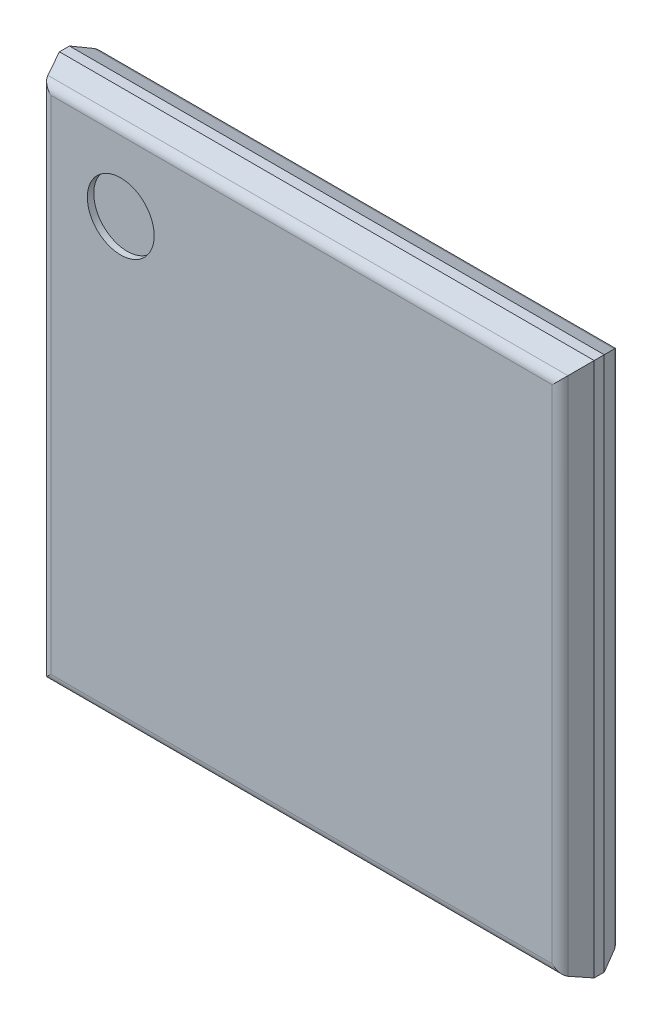
ISO-10303-21;
HEADER;
FILE_DESCRIPTION(('STEP AP214'),'2;1');
FILE_NAME('part.step','',(''),(''),'','','');
FILE_SCHEMA(('AUTOMOTIVE_DESIGN { 1 0 10303 214 1 1 1 1 }'));
ENDSEC;
DATA;
#1=APPLICATION_CONTEXT('core data for automotive mechanical design processes');
#2=APPLICATION_PROTOCOL_DEFINITION('international standard','automotive_design',2000,#1);
#3=PRODUCT_CONTEXT('',#1,'mechanical');
#4=PRODUCT('Part','Part','',(#3));
#5=PRODUCT_RELATED_PRODUCT_CATEGORY('part','',(#4));
#6=PRODUCT_DEFINITION_FORMATION('','',#4);
#7=PRODUCT_DEFINITION_CONTEXT('part definition',#1,'design');
#8=PRODUCT_DEFINITION('design','',#6,#7);
#9=PRODUCT_DEFINITION_SHAPE('','',#8);
#10=(LENGTH_UNIT() NAMED_UNIT(*) SI_UNIT(.MILLI.,.METRE.));
#11=(NAMED_UNIT(*) PLANE_ANGLE_UNIT() SI_UNIT($,.RADIAN.));
#12=(NAMED_UNIT(*) SI_UNIT($,.STERADIAN.) SOLID_ANGLE_UNIT());
#13=UNCERTAINTY_MEASURE_WITH_UNIT(LENGTH_MEASURE(1.E-05),#10,'distance_accuracy_value','');
#14=(GEOMETRIC_REPRESENTATION_CONTEXT(3) GLOBAL_UNCERTAINTY_ASSIGNED_CONTEXT((#13)) GLOBAL_UNIT_ASSIGNED_CONTEXT((#10,
#11,#12)) REPRESENTATION_CONTEXT('',''));
#15=CARTESIAN_POINT('',(0.,0.,0.));
#16=DIRECTION('',(0.,0.,1.));
#17=DIRECTION('',(1.,0.,0.));
#18=AXIS2_PLACEMENT_3D('',#15,#16,#17);
#19=CARTESIAN_POINT('',(-3.38,3.38,1.08));
#20=DIRECTION('',(0.,0.,1.));
#21=DIRECTION('',(1.,0.,0.));
#22=AXIS2_PLACEMENT_3D('',#19,#20,#21);
#23=PLANE('',#22);
#24=CARTESIAN_POINT('',(-3.38,3.38,1.08));
#25=DIRECTION('',(0.,0.,1.));
#26=DIRECTION('',(1.,0.,0.));
#27=AXIS2_PLACEMENT_3D('',#24,#25,#26);
#28=CIRCLE('',#27,0.625);
#29=CARTESIAN_POINT('',(-2.755,3.38,1.08));
#30=VERTEX_POINT('',#29);
#31=EDGE_CURVE('E27',#30,#30,#28,.T.);
#32=ORIENTED_EDGE('',*,*,#31,.T.);
#33=EDGE_LOOP('',(#32));
#34=FACE_BOUND('',#33,.T.);
#35=ADVANCED_FACE('F16',(#34),#23,.T.);
#36=CARTESIAN_POINT('',(-3.38,3.38,1.08));
#37=DIRECTION('',(0.,0.,1.));
#38=DIRECTION('',(1.,0.,0.));
#39=AXIS2_PLACEMENT_3D('',#36,#37,#38);
#40=CYLINDRICAL_SURFACE('',#39,0.625);
#41=ORIENTED_EDGE('',*,*,#31,.F.);
#42=DIRECTION('',(0.,0.,1.));
#43=VECTOR('',#42,1.);
#44=CARTESIAN_POINT('',(-2.755,3.38,1.08));
#45=LINE('',#44,#43);
#46=CARTESIAN_POINT('',(-2.755,3.38,1.2));
#47=VERTEX_POINT('',#46);
#48=EDGE_CURVE('E11',#30,#47,#45,.T.);
#49=ORIENTED_EDGE('',*,*,#48,.T.);
#50=CARTESIAN_POINT('',(-3.38,3.38,1.2));
#51=DIRECTION('',(0.,0.,1.));
#52=DIRECTION('',(1.,0.,0.));
#53=AXIS2_PLACEMENT_3D('',#50,#51,#52);
#54=CIRCLE('',#53,0.625);
#55=EDGE_CURVE('E278',#47,#47,#54,.T.);
#56=ORIENTED_EDGE('',*,*,#55,.T.);
#57=ORIENTED_EDGE('',*,*,#48,.F.);
#58=EDGE_LOOP('',(#41,#49,#56,#57));
#59=FACE_BOUND('',#58,.T.);
#60=ADVANCED_FACE('F576',(#59),#40,.F.);
#61=CARTESIAN_POINT('',(4.688842141657,-4.8175,1.0125));
#62=DIRECTION('',(0.,1.,0.));
#63=DIRECTION('',(0.,0.,1.));
#64=AXIS2_PLACEMENT_3D('',#61,#62,#63);
#65=CYLINDRICAL_SURFACE('',#64,0.1875);
#66=CARTESIAN_POINT('',(4.688842141657,-4.688842141657,1.0125));
#67=DIRECTION('',(-0.707106781186548,-0.707106781186548,0.));
#68=DIRECTION('',(0.707106781186548,-0.707106781186548,0.));
#69=AXIS2_PLACEMENT_3D('',#66,#67,#68);
#70=ELLIPSE('',#69,0.265165042945,0.1875);
#71=CARTESIAN_POINT('',(4.863787298788,-4.863787298788,1.079956964032));
#72=VERTEX_POINT('',#71);
#73=CARTESIAN_POINT('',(4.688842141657,-4.688842141657,1.2));
#74=VERTEX_POINT('',#73);
#75=EDGE_CURVE('E116',#72,#74,#70,.T.);
#76=ORIENTED_EDGE('',*,*,#75,.F.);
#77=DIRECTION('',(0.,1.,0.));
#78=VECTOR('',#77,1.);
#79=CARTESIAN_POINT('',(4.863787298788,-4.8175,1.079956964032));
#80=LINE('',#79,#78);
#81=CARTESIAN_POINT('',(4.863787298788,4.863787298788,1.079956964032));
#82=VERTEX_POINT('',#81);
#83=EDGE_CURVE('E263',#72,#82,#80,.T.);
#84=ORIENTED_EDGE('',*,*,#83,.T.);
#85=CARTESIAN_POINT('',(4.688842141657,4.688842141657,1.0125));
#86=DIRECTION('',(-0.707106781186548,0.707106781186548,0.));
#87=DIRECTION('',(0.707106781186548,0.707106781186548,0.));
#88=AXIS2_PLACEMENT_3D('',#85,#86,#87);
#89=ELLIPSE('',#88,0.265165042945,0.1875);
#90=CARTESIAN_POINT('',(4.688842141657,4.688842141657,1.2));
#91=VERTEX_POINT('',#90);
#92=EDGE_CURVE('E281',#91,#82,#89,.T.);
#93=ORIENTED_EDGE('',*,*,#92,.F.);
#94=DIRECTION('',(0.,1.,0.));
#95=VECTOR('',#94,1.);
#96=CARTESIAN_POINT('',(4.688842141657,-4.8175,1.2));
#97=LINE('',#96,#95);
#98=EDGE_CURVE('E300',#74,#91,#97,.T.);
#99=ORIENTED_EDGE('',*,*,#98,.F.);
#100=EDGE_LOOP('',(#76,#84,#93,#99));
#101=FACE_BOUND('',#100,.T.);
#102=ADVANCED_FACE('F571',(#101),#65,.T.);
#103=CARTESIAN_POINT('',(-4.8175,4.688842141657,1.0125));
#104=DIRECTION('',(1.,0.,0.));
#105=DIRECTION('',(0.,0.,1.));
#106=AXIS2_PLACEMENT_3D('',#103,#104,#105);
#107=CYLINDRICAL_SURFACE('',#106,0.1875);
#108=DIRECTION('',(1.,0.,0.));
#109=VECTOR('',#108,1.);
#110=CARTESIAN_POINT('',(-4.8175,4.688842141657,1.2));
#111=LINE('',#110,#109);
#112=CARTESIAN_POINT('',(-4.688842141657,4.688842141657,1.2));
#113=VERTEX_POINT('',#112);
#114=EDGE_CURVE('E282',#113,#91,#111,.T.);
#115=ORIENTED_EDGE('',*,*,#114,.T.);
#116=ORIENTED_EDGE('',*,*,#92,.T.);
#117=DIRECTION('',(1.,0.,0.));
#118=VECTOR('',#117,1.);
#119=CARTESIAN_POINT('',(-4.8175,4.863787298788,1.079956964032));
#120=LINE('',#119,#118);
#121=CARTESIAN_POINT('',(-4.863787298788,4.863787298788,1.079956964032));
#122=VERTEX_POINT('',#121);
#123=EDGE_CURVE('E202',#122,#82,#120,.T.);
#124=ORIENTED_EDGE('',*,*,#123,.F.);
#125=CARTESIAN_POINT('',(-4.688842141657,4.688842141657,1.0125));
#126=DIRECTION('',(0.707106781186548,0.707106781186548,0.));
#127=DIRECTION('',(-0.707106781186548,0.707106781186548,0.));
#128=AXIS2_PLACEMENT_3D('',#125,#126,#127);
#129=ELLIPSE('',#128,0.265165042945,0.1875);
#130=EDGE_CURVE('E199',#122,#113,#129,.T.);
#131=ORIENTED_EDGE('',*,*,#130,.T.);
#132=EDGE_LOOP('',(#115,#116,#124,#131));
#133=FACE_BOUND('',#132,.T.);
#134=ADVANCED_FACE('F484',(#133),#107,.T.);
#135=CARTESIAN_POINT('',(-5.,-5.,1.2));
#136=DIRECTION('',(0.,0.,1.));
#137=DIRECTION('',(1.,0.,0.));
#138=AXIS2_PLACEMENT_3D('',#135,#136,#137);
#139=PLANE('',#138);
#140=ORIENTED_EDGE('',*,*,#55,.F.);
#141=EDGE_LOOP('',(#140));
#142=FACE_BOUND('',#141,.T.);
#143=DIRECTION('',(0.,1.,0.));
#144=VECTOR('',#143,1.);
#145=CARTESIAN_POINT('',(-4.688842141657,-4.8175,1.2));
#146=LINE('',#145,#144);
#147=CARTESIAN_POINT('',(-4.688842141657,-4.688842141657,1.2));
#148=VERTEX_POINT('',#147);
#149=EDGE_CURVE('E203',#148,#113,#146,.T.);
#150=ORIENTED_EDGE('',*,*,#149,.F.);
#151=DIRECTION('',(1.,0.,0.));
#152=VECTOR('',#151,1.);
#153=CARTESIAN_POINT('',(-4.8175,-4.688842141657,1.2));
#154=LINE('',#153,#152);
#155=EDGE_CURVE('E127',#148,#74,#154,.T.);
#156=ORIENTED_EDGE('',*,*,#155,.T.);
#157=ORIENTED_EDGE('',*,*,#98,.T.);
#158=ORIENTED_EDGE('',*,*,#114,.F.);
#159=EDGE_LOOP('',(#150,#156,#157,#158));
#160=FACE_BOUND('',#159,.T.);
#161=ADVANCED_FACE('F478',(#142,#160),#139,.T.);
#162=CARTESIAN_POINT('',(-4.8175,-4.688842141657,1.0125));
#163=DIRECTION('',(1.,0.,0.));
#164=DIRECTION('',(0.,-0.933040838032048,0.359770474837019));
#165=AXIS2_PLACEMENT_3D('',#162,#163,#164);
#166=CYLINDRICAL_SURFACE('',#165,0.1875);
#167=DIRECTION('',(1.,0.,0.));
#168=VECTOR('',#167,1.);
#169=CARTESIAN_POINT('',(-4.8175,-4.863787298788,1.079956964032));
#170=LINE('',#169,#168);
#171=CARTESIAN_POINT('',(-4.863787298788,-4.863787298788,1.079956964032));
#172=VERTEX_POINT('',#171);
#173=EDGE_CURVE('E215',#172,#72,#170,.T.);
#174=ORIENTED_EDGE('',*,*,#173,.T.);
#175=ORIENTED_EDGE('',*,*,#75,.T.);
#176=ORIENTED_EDGE('',*,*,#155,.F.);
#177=CARTESIAN_POINT('',(-4.688842141657,-4.688842141657,1.0125));
#178=DIRECTION('',(-0.707106781186548,0.707106781186548,0.));
#179=DIRECTION('',(0.707106781186548,0.707106781186548,0.));
#180=AXIS2_PLACEMENT_3D('',#177,#178,#179);
#181=ELLIPSE('',#180,0.265165042945,0.1875);
#182=EDGE_CURVE('E224',#172,#148,#181,.T.);
#183=ORIENTED_EDGE('',*,*,#182,.F.);
#184=EDGE_LOOP('',(#174,#175,#176,#183));
#185=FACE_BOUND('',#184,.T.);
#186=ADVANCED_FACE('F483',(#185),#166,.T.);
#187=CARTESIAN_POINT('',(4.90875,-5.,0.963349183924));
#188=DIRECTION('',(0.933040838032048,0.,0.359770474837019));
#189=DIRECTION('',(0.,-1.,0.));
#190=AXIS2_PLACEMENT_3D('',#187,#188,#189);
#191=PLANE('',#190);
#192=DIRECTION('',(-0.338528266936157,0.338528266936157,0.877950582305408));
#193=VECTOR('',#192,1.);
#194=CARTESIAN_POINT('',(4.346200439037,-4.346200439037,2.422284117461));
#195=LINE('',#194,#193);
#196=CARTESIAN_POINT('',(5.,-5.,0.726698367847));
#197=VERTEX_POINT('',#196);
#198=EDGE_CURVE('E211',#197,#72,#195,.T.);
#199=ORIENTED_EDGE('',*,*,#198,.F.);
#200=DIRECTION('',(0.,1.,0.));
#201=VECTOR('',#200,1.);
#202=CARTESIAN_POINT('',(5.,-5.,0.726698367847));
#203=LINE('',#202,#201);
#204=CARTESIAN_POINT('',(5.,5.,0.726698367847));
#205=VERTEX_POINT('',#204);
#206=EDGE_CURVE('E158',#197,#205,#203,.T.);
#207=ORIENTED_EDGE('',*,*,#206,.T.);
#208=DIRECTION('',(-0.338528266936157,-0.338528266936157,0.877950582305408));
#209=VECTOR('',#208,1.);
#210=CARTESIAN_POINT('',(3.773193501464,3.773193501464,3.908339562878));
#211=LINE('',#210,#209);
#212=EDGE_CURVE('E152',#205,#82,#211,.T.);
#213=ORIENTED_EDGE('',*,*,#212,.T.);
#214=ORIENTED_EDGE('',*,*,#83,.F.);
#215=EDGE_LOOP('',(#199,#207,#213,#214));
#216=FACE_BOUND('',#215,.T.);
#217=ADVANCED_FACE('F505',(#216),#191,.T.);
#218=CARTESIAN_POINT('',(-5.,4.90875,0.963349183924));
#219=DIRECTION('',(0.,0.933040838032048,0.359770474837019));
#220=DIRECTION('',(1.,0.,0.));
#221=AXIS2_PLACEMENT_3D('',#218,#219,#220);
#222=PLANE('',#221);
#223=ORIENTED_EDGE('',*,*,#123,.T.);
#224=ORIENTED_EDGE('',*,*,#212,.F.);
#225=DIRECTION('',(1.,0.,0.));
#226=VECTOR('',#225,1.);
#227=CARTESIAN_POINT('',(-5.,5.,0.726698367847));
#228=LINE('',#227,#226);
#229=CARTESIAN_POINT('',(-5.,5.,0.726698367847));
#230=VERTEX_POINT('',#229);
#231=EDGE_CURVE('E145',#230,#205,#228,.T.);
#232=ORIENTED_EDGE('',*,*,#231,.F.);
#233=DIRECTION('',(0.338528266936157,-0.338528266936157,0.877950582305408));
#234=VECTOR('',#233,1.);
#235=CARTESIAN_POINT('',(-4.346200439037,4.346200439037,2.422284117461));
#236=LINE('',#235,#234);
#237=EDGE_CURVE('E149',#230,#122,#236,.T.);
#238=ORIENTED_EDGE('',*,*,#237,.T.);
#239=EDGE_LOOP('',(#223,#224,#232,#238));
#240=FACE_BOUND('',#239,.T.);
#241=ADVANCED_FACE('F148',(#240),#222,.T.);
#242=CARTESIAN_POINT('',(-4.688842141657,-4.8175,1.0125));
#243=DIRECTION('',(0.,1.,0.));
#244=DIRECTION('',(-0.933040838032048,0.,0.359770474837019));
#245=AXIS2_PLACEMENT_3D('',#242,#243,#244);
#246=CYLINDRICAL_SURFACE('',#245,0.1875);
#247=ORIENTED_EDGE('',*,*,#182,.T.);
#248=ORIENTED_EDGE('',*,*,#149,.T.);
#249=ORIENTED_EDGE('',*,*,#130,.F.);
#250=DIRECTION('',(0.,1.,0.));
#251=VECTOR('',#250,1.);
#252=CARTESIAN_POINT('',(-4.863787298788,-4.8175,1.079956964032));
#253=LINE('',#252,#251);
#254=EDGE_CURVE('E168',#172,#122,#253,.T.);
#255=ORIENTED_EDGE('',*,*,#254,.F.);
#256=EDGE_LOOP('',(#247,#248,#249,#255));
#257=FACE_BOUND('',#256,.T.);
#258=ADVANCED_FACE('F504',(#257),#246,.T.);
#259=CARTESIAN_POINT('',(-5.,-4.90875,0.963349183924));
#260=DIRECTION('',(0.,0.933040838032048,-0.359770474837019));
#261=DIRECTION('',(-1.,0.,0.));
#262=AXIS2_PLACEMENT_3D('',#259,#260,#261);
#263=PLANE('',#262);
#264=DIRECTION('',(0.338528266936157,0.338528266936157,0.877950582305408));
#265=VECTOR('',#264,1.);
#266=CARTESIAN_POINT('',(-4.919207376611,-4.919207376611,0.936228672045));
#267=LINE('',#266,#265);
#268=CARTESIAN_POINT('',(-5.,-5.,0.726698367847));
#269=VERTEX_POINT('',#268);
#270=EDGE_CURVE('E170',#269,#172,#267,.T.);
#271=ORIENTED_EDGE('',*,*,#270,.F.);
#272=DIRECTION('',(1.,0.,0.));
#273=VECTOR('',#272,1.);
#274=CARTESIAN_POINT('',(-5.,-5.,0.726698367847));
#275=LINE('',#274,#273);
#276=EDGE_CURVE('E20',#269,#197,#275,.T.);
#277=ORIENTED_EDGE('',*,*,#276,.T.);
#278=ORIENTED_EDGE('',*,*,#198,.T.);
#279=ORIENTED_EDGE('',*,*,#173,.F.);
#280=EDGE_LOOP('',(#271,#277,#278,#279));
#281=FACE_BOUND('',#280,.T.);
#282=ADVANCED_FACE('F329',(#281),#263,.F.);
#283=CARTESIAN_POINT('',(5.,-5.,0.1));
#284=DIRECTION('',(1.,0.,0.));
#285=DIRECTION('',(0.,1.,0.));
#286=AXIS2_PLACEMENT_3D('',#283,#284,#285);
#287=PLANE('',#286);
#288=DIRECTION('',(0.,0.,1.));
#289=VECTOR('',#288,1.);
#290=CARTESIAN_POINT('',(5.,-5.,0.1));
#291=LINE('',#290,#289);
#292=CARTESIAN_POINT('',(5.,-5.,0.539198367847));
#293=VERTEX_POINT('',#292);
#294=EDGE_CURVE('E277',#293,#197,#291,.T.);
#295=ORIENTED_EDGE('',*,*,#294,.F.);
#296=DIRECTION('',(0.,1.,0.));
#297=VECTOR('',#296,1.);
#298=CARTESIAN_POINT('',(5.,-5.,0.539198367847));
#299=LINE('',#298,#297);
#300=CARTESIAN_POINT('',(5.,5.,0.539198367847));
#301=VERTEX_POINT('',#300);
#302=EDGE_CURVE('E269',#293,#301,#299,.T.);
#303=ORIENTED_EDGE('',*,*,#302,.T.);
#304=DIRECTION('',(0.,0.,1.));
#305=VECTOR('',#304,1.);
#306=CARTESIAN_POINT('',(5.,5.,0.1));
#307=LINE('',#306,#305);
#308=EDGE_CURVE('E159',#301,#205,#307,.T.);
#309=ORIENTED_EDGE('',*,*,#308,.T.);
#310=ORIENTED_EDGE('',*,*,#206,.F.);
#311=EDGE_LOOP('',(#295,#303,#309,#310));
#312=FACE_BOUND('',#311,.T.);
#313=ADVANCED_FACE('F524',(#312),#287,.T.);
#314=CARTESIAN_POINT('',(4.692368725118,-4.8175,0.2875));
#315=DIRECTION('',(0.,1.,0.));
#316=DIRECTION('',(0.,0.,-1.));
#317=AXIS2_PLACEMENT_3D('',#314,#315,#316);
#318=CYLINDRICAL_SURFACE('',#317,0.1875);
#319=DIRECTION('',(0.,1.,0.));
#320=VECTOR('',#319,1.);
#321=CARTESIAN_POINT('',(4.692368725118,-4.8175,0.1));
#322=LINE('',#321,#320);
#323=CARTESIAN_POINT('',(4.692368725118,-4.692368725118,0.1));
#324=VERTEX_POINT('',#323);
#325=CARTESIAN_POINT('',(4.692368725118,4.692368725118,0.1));
#326=VERTEX_POINT('',#325);
#327=EDGE_CURVE('E238',#324,#326,#322,.T.);
#328=ORIENTED_EDGE('',*,*,#327,.T.);
#329=CARTESIAN_POINT('',(4.692368725118,4.692368725118,0.2875));
#330=DIRECTION('',(0.707106781186548,-0.707106781186548,0.));
#331=DIRECTION('',(0.707106781186548,0.707106781186548,0.));
#332=AXIS2_PLACEMENT_3D('',#329,#330,#331);
#333=ELLIPSE('',#332,0.265165042945,0.1875);
#334=CARTESIAN_POINT('',(4.865515454022,4.865515454022,0.215552378291));
#335=VERTEX_POINT('',#334);
#336=EDGE_CURVE('E242',#326,#335,#333,.T.);
#337=ORIENTED_EDGE('',*,*,#336,.T.);
#338=DIRECTION('',(0.,1.,0.));
#339=VECTOR('',#338,1.);
#340=CARTESIAN_POINT('',(4.865515454022,-4.8175,0.215552378291));
#341=LINE('',#340,#339);
#342=CARTESIAN_POINT('',(4.865515454022,-4.865515454022,0.215552378291));
#343=VERTEX_POINT('',#342);
#344=EDGE_CURVE('E273',#343,#335,#341,.T.);
#345=ORIENTED_EDGE('',*,*,#344,.F.);
#346=CARTESIAN_POINT('',(4.692368725118,-4.692368725118,0.2875));
#347=DIRECTION('',(0.707106781186548,0.707106781186548,0.));
#348=DIRECTION('',(0.707106781186548,-0.707106781186548,0.));
#349=AXIS2_PLACEMENT_3D('',#346,#347,#348);
#350=ELLIPSE('',#349,0.265165042945,0.1875);
#351=EDGE_CURVE('E209',#343,#324,#350,.T.);
#352=ORIENTED_EDGE('',*,*,#351,.T.);
#353=EDGE_LOOP('',(#328,#337,#345,#352));
#354=FACE_BOUND('',#353,.T.);
#355=ADVANCED_FACE('F519',(#354),#318,.T.);
#356=CARTESIAN_POINT('',(-5.,5.,0.1));
#357=DIRECTION('',(0.,1.,0.));
#358=DIRECTION('',(1.,0.,0.));
#359=AXIS2_PLACEMENT_3D('',#356,#357,#358);
#360=PLANE('',#359);
#361=ORIENTED_EDGE('',*,*,#308,.F.);
#362=DIRECTION('',(1.,0.,0.));
#363=VECTOR('',#362,1.);
#364=CARTESIAN_POINT('',(-5.,5.,0.539198367847));
#365=LINE('',#364,#363);
#366=CARTESIAN_POINT('',(-5.,5.,0.539198367847));
#367=VERTEX_POINT('',#366);
#368=EDGE_CURVE('E176',#367,#301,#365,.T.);
#369=ORIENTED_EDGE('',*,*,#368,.F.);
#370=DIRECTION('',(0.,0.,1.));
#371=VECTOR('',#370,1.);
#372=CARTESIAN_POINT('',(-5.,5.,0.1));
#373=LINE('',#372,#371);
#374=EDGE_CURVE('E173',#367,#230,#373,.T.);
#375=ORIENTED_EDGE('',*,*,#374,.T.);
#376=ORIENTED_EDGE('',*,*,#231,.T.);
#377=EDGE_LOOP('',(#361,#369,#375,#376));
#378=FACE_BOUND('',#377,.T.);
#379=ADVANCED_FACE('F174',(#378),#360,.T.);
#380=CARTESIAN_POINT('',(-4.90875,-5.,0.963349183924));
#381=DIRECTION('',(0.933040838032048,0.,-0.359770474837019));
#382=DIRECTION('',(0.,-1.,0.));
#383=AXIS2_PLACEMENT_3D('',#380,#381,#382);
#384=PLANE('',#383);
#385=ORIENTED_EDGE('',*,*,#254,.T.);
#386=ORIENTED_EDGE('',*,*,#237,.F.);
#387=DIRECTION('',(0.,1.,0.));
#388=VECTOR('',#387,1.);
#389=CARTESIAN_POINT('',(-5.,-5.,0.726698367847));
#390=LINE('',#389,#388);
#391=EDGE_CURVE('E166',#269,#230,#390,.T.);
#392=ORIENTED_EDGE('',*,*,#391,.F.);
#393=ORIENTED_EDGE('',*,*,#270,.T.);
#394=EDGE_LOOP('',(#385,#386,#392,#393));
#395=FACE_BOUND('',#394,.T.);
#396=ADVANCED_FACE('F163',(#395),#384,.F.);
#397=CARTESIAN_POINT('',(-4.8175,4.692368725118,0.2875));
#398=DIRECTION('',(1.,0.,0.));
#399=DIRECTION('',(0.,0.,-1.));
#400=AXIS2_PLACEMENT_3D('',#397,#398,#399);
#401=CYLINDRICAL_SURFACE('',#400,0.1875);
#402=CARTESIAN_POINT('',(-4.692368725118,4.692368725118,0.2875));
#403=DIRECTION('',(-0.707106781186548,-0.707106781186548,0.));
#404=DIRECTION('',(-0.707106781186548,0.707106781186548,0.));
#405=AXIS2_PLACEMENT_3D('',#402,#403,#404);
#406=ELLIPSE('',#405,0.265165042945,0.1875);
#407=CARTESIAN_POINT('',(-4.865515454022,4.865515454022,0.215552378291));
#408=VERTEX_POINT('',#407);
#409=CARTESIAN_POINT('',(-4.692368725118,4.692368725118,0.1));
#410=VERTEX_POINT('',#409);
#411=EDGE_CURVE('E237',#408,#410,#406,.T.);
#412=ORIENTED_EDGE('',*,*,#411,.F.);
#413=DIRECTION('',(1.,0.,0.));
#414=VECTOR('',#413,1.);
#415=CARTESIAN_POINT('',(-4.8175,4.865515454022,0.215552378291));
#416=LINE('',#415,#414);
#417=EDGE_CURVE('E210',#408,#335,#416,.T.);
#418=ORIENTED_EDGE('',*,*,#417,.T.);
#419=ORIENTED_EDGE('',*,*,#336,.F.);
#420=DIRECTION('',(1.,0.,0.));
#421=VECTOR('',#420,1.);
#422=CARTESIAN_POINT('',(-4.8175,4.692368725118,0.1));
#423=LINE('',#422,#421);
#424=EDGE_CURVE('E243',#410,#326,#423,.T.);
#425=ORIENTED_EDGE('',*,*,#424,.F.);
#426=EDGE_LOOP('',(#412,#418,#419,#425));
#427=FACE_BOUND('',#426,.T.);
#428=ADVANCED_FACE('F18',(#427),#401,.T.);
#429=CARTESIAN_POINT('',(-5.,-5.,0.1));
#430=DIRECTION('',(0.,0.,1.));
#431=DIRECTION('',(1.,0.,0.));
#432=AXIS2_PLACEMENT_3D('',#429,#430,#431);
#433=PLANE('',#432);
#434=ORIENTED_EDGE('',*,*,#424,.T.);
#435=ORIENTED_EDGE('',*,*,#327,.F.);
#436=DIRECTION('',(1.,0.,0.));
#437=VECTOR('',#436,1.);
#438=CARTESIAN_POINT('',(-4.8175,-4.692368725118,0.1));
#439=LINE('',#438,#437);
#440=CARTESIAN_POINT('',(-4.692368725118,-4.692368725118,0.1));
#441=VERTEX_POINT('',#440);
#442=EDGE_CURVE('E205',#441,#324,#439,.T.);
#443=ORIENTED_EDGE('',*,*,#442,.F.);
#444=DIRECTION('',(0.,1.,0.));
#445=VECTOR('',#444,1.);
#446=CARTESIAN_POINT('',(-4.692368725118,-4.8175,0.1));
#447=LINE('',#446,#445);
#448=EDGE_CURVE('E193',#441,#410,#447,.T.);
#449=ORIENTED_EDGE('',*,*,#448,.T.);
#450=EDGE_LOOP('',(#434,#435,#443,#449));
#451=FACE_BOUND('',#450,.T.);
#452=ADVANCED_FACE('F357',(#451),#433,.F.);
#453=CARTESIAN_POINT('',(4.90875,-5.,0.319599183924));
#454=DIRECTION('',(-0.923449220825214,0.,0.383720649115089));
#455=DIRECTION('',(0.,1.,0.));
#456=AXIS2_PLACEMENT_3D('',#453,#454,#455);
#457=PLANE('',#456);
#458=ORIENTED_EDGE('',*,*,#344,.T.);
#459=DIRECTION('',(-0.358251270472154,-0.358251270472154,-0.86215546997637));
#460=VECTOR('',#459,1.);
#461=CARTESIAN_POINT('',(3.637021659566,3.637021659566,-2.740899509027));
#462=LINE('',#461,#460);
#463=EDGE_CURVE('E258',#301,#335,#462,.T.);
#464=ORIENTED_EDGE('',*,*,#463,.F.);
#465=ORIENTED_EDGE('',*,*,#302,.F.);
#466=DIRECTION('',(-0.358251270472154,0.358251270472154,-0.86215546997637));
#467=VECTOR('',#466,1.);
#468=CARTESIAN_POINT('',(4.278741523542,-4.278741523542,-1.196558046708));
#469=LINE('',#468,#467);
#470=EDGE_CURVE('E255',#293,#343,#469,.T.);
#471=ORIENTED_EDGE('',*,*,#470,.T.);
#472=EDGE_LOOP('',(#458,#464,#465,#471));
#473=FACE_BOUND('',#472,.T.);
#474=ADVANCED_FACE('F364',(#473),#457,.F.);
#475=CARTESIAN_POINT('',(-5.,-5.,0.1));
#476=DIRECTION('',(0.,1.,0.));
#477=DIRECTION('',(1.,0.,0.));
#478=AXIS2_PLACEMENT_3D('',#475,#476,#477);
#479=PLANE('',#478);
#480=ORIENTED_EDGE('',*,*,#276,.F.);
#481=DIRECTION('',(0.,0.,1.));
#482=VECTOR('',#481,1.);
#483=CARTESIAN_POINT('',(-5.,-5.,0.1));
#484=LINE('',#483,#482);
#485=CARTESIAN_POINT('',(-5.,-5.,0.539198367847));
#486=VERTEX_POINT('',#485);
#487=EDGE_CURVE('E181',#486,#269,#484,.T.);
#488=ORIENTED_EDGE('',*,*,#487,.F.);
#489=DIRECTION('',(1.,0.,0.));
#490=VECTOR('',#489,1.);
#491=CARTESIAN_POINT('',(-5.,-5.,0.539198367847));
#492=LINE('',#491,#490);
#493=EDGE_CURVE('E197',#486,#293,#492,.T.);
#494=ORIENTED_EDGE('',*,*,#493,.T.);
#495=ORIENTED_EDGE('',*,*,#294,.T.);
#496=EDGE_LOOP('',(#480,#488,#494,#495));
#497=FACE_BOUND('',#496,.T.);
#498=ADVANCED_FACE('F331',(#497),#479,.F.);
#499=CARTESIAN_POINT('',(-4.8175,-4.692368725118,0.2875));
#500=DIRECTION('',(1.,0.,0.));
#501=DIRECTION('',(0.,-0.923449220825214,-0.383720649115089));
#502=AXIS2_PLACEMENT_3D('',#499,#500,#501);
#503=CYLINDRICAL_SURFACE('',#502,0.1875);
#504=CARTESIAN_POINT('',(-4.692368725118,-4.692368725118,0.2875));
#505=DIRECTION('',(0.707106781186548,-0.707106781186548,0.));
#506=DIRECTION('',(0.707106781186548,0.707106781186548,0.));
#507=AXIS2_PLACEMENT_3D('',#504,#505,#506);
#508=ELLIPSE('',#507,0.265165042945,0.1875);
#509=CARTESIAN_POINT('',(-4.865515454022,-4.865515454022,0.215552378291));
#510=VERTEX_POINT('',#509);
#511=EDGE_CURVE('E186',#510,#441,#508,.T.);
#512=ORIENTED_EDGE('',*,*,#511,.T.);
#513=ORIENTED_EDGE('',*,*,#442,.T.);
#514=ORIENTED_EDGE('',*,*,#351,.F.);
#515=DIRECTION('',(1.,0.,0.));
#516=VECTOR('',#515,1.);
#517=CARTESIAN_POINT('',(-4.8175,-4.865515454022,0.215552378291));
#518=LINE('',#517,#516);
#519=EDGE_CURVE('E233',#510,#343,#518,.T.);
#520=ORIENTED_EDGE('',*,*,#519,.F.);
#521=EDGE_LOOP('',(#512,#513,#514,#520));
#522=FACE_BOUND('',#521,.T.);
#523=ADVANCED_FACE('F360',(#522),#503,.T.);
#524=CARTESIAN_POINT('',(-5.,4.90875,0.319599183924));
#525=DIRECTION('',(0.,-0.923449220825214,0.383720649115089));
#526=DIRECTION('',(-1.,0.,0.));
#527=AXIS2_PLACEMENT_3D('',#524,#525,#526);
#528=PLANE('',#527);
#529=DIRECTION('',(0.358251270472154,-0.358251270472154,-0.86215546997637));
#530=VECTOR('',#529,1.);
#531=CARTESIAN_POINT('',(-4.278741523542,4.278741523542,-1.196558046708));
#532=LINE('',#531,#530);
#533=EDGE_CURVE('E225',#367,#408,#532,.T.);
#534=ORIENTED_EDGE('',*,*,#533,.F.);
#535=ORIENTED_EDGE('',*,*,#368,.T.);
#536=ORIENTED_EDGE('',*,*,#463,.T.);
#537=ORIENTED_EDGE('',*,*,#417,.F.);
#538=EDGE_LOOP('',(#534,#535,#536,#537));
#539=FACE_BOUND('',#538,.T.);
#540=ADVANCED_FACE('F353',(#539),#528,.F.);
#541=CARTESIAN_POINT('',(-5.,-5.,0.1));
#542=DIRECTION('',(1.,0.,0.));
#543=DIRECTION('',(0.,1.,0.));
#544=AXIS2_PLACEMENT_3D('',#541,#542,#543);
#545=PLANE('',#544);
#546=ORIENTED_EDGE('',*,*,#391,.T.);
#547=ORIENTED_EDGE('',*,*,#374,.F.);
#548=DIRECTION('',(0.,1.,0.));
#549=VECTOR('',#548,1.);
#550=CARTESIAN_POINT('',(-5.,-5.,0.539198367847));
#551=LINE('',#550,#549);
#552=EDGE_CURVE('E219',#486,#367,#551,.T.);
#553=ORIENTED_EDGE('',*,*,#552,.F.);
#554=ORIENTED_EDGE('',*,*,#487,.T.);
#555=EDGE_LOOP('',(#546,#547,#553,#554));
#556=FACE_BOUND('',#555,.T.);
#557=ADVANCED_FACE('F184',(#556),#545,.F.);
#558=CARTESIAN_POINT('',(-4.692368725118,-4.8175,0.2875));
#559=DIRECTION('',(0.,1.,0.));
#560=DIRECTION('',(-0.923449220825214,0.,-0.383720649115089));
#561=AXIS2_PLACEMENT_3D('',#558,#559,#560);
#562=CYLINDRICAL_SURFACE('',#561,0.1875);
#563=DIRECTION('',(0.,1.,0.));
#564=VECTOR('',#563,1.);
#565=CARTESIAN_POINT('',(-4.865515454022,-4.8175,0.215552378291));
#566=LINE('',#565,#564);
#567=EDGE_CURVE('E229',#510,#408,#566,.T.);
#568=ORIENTED_EDGE('',*,*,#567,.T.);
#569=ORIENTED_EDGE('',*,*,#411,.T.);
#570=ORIENTED_EDGE('',*,*,#448,.F.);
#571=ORIENTED_EDGE('',*,*,#511,.F.);
#572=EDGE_LOOP('',(#568,#569,#570,#571));
#573=FACE_BOUND('',#572,.T.);
#574=ADVANCED_FACE('F346',(#573),#562,.T.);
#575=CARTESIAN_POINT('',(-5.,-4.90875,0.319599183924));
#576=DIRECTION('',(0.,-0.923449220825214,-0.383720649115089));
#577=DIRECTION('',(0.,0.383720649115089,-0.923449220825214));
#578=AXIS2_PLACEMENT_3D('',#575,#576,#577);
#579=PLANE('',#578);
#580=ORIENTED_EDGE('',*,*,#519,.T.);
#581=ORIENTED_EDGE('',*,*,#470,.F.);
#582=ORIENTED_EDGE('',*,*,#493,.F.);
#583=DIRECTION('',(0.358251270472154,0.358251270472154,-0.86215546997637));
#584=VECTOR('',#583,1.);
#585=CARTESIAN_POINT('',(-4.920461387518,-4.920461387518,0.347783415611));
#586=LINE('',#585,#584);
#587=EDGE_CURVE('E216',#486,#510,#586,.T.);
#588=ORIENTED_EDGE('',*,*,#587,.T.);
#589=EDGE_LOOP('',(#580,#581,#582,#588));
#590=FACE_BOUND('',#589,.T.);
#591=ADVANCED_FACE('F337',(#590),#579,.T.);
#592=CARTESIAN_POINT('',(-4.90875,-5.,0.319599183924));
#593=DIRECTION('',(-0.923449220825214,0.,-0.383720649115089));
#594=DIRECTION('',(-0.383720649115089,0.,0.923449220825214));
#595=AXIS2_PLACEMENT_3D('',#592,#593,#594);
#596=PLANE('',#595);
#597=ORIENTED_EDGE('',*,*,#587,.F.);
#598=ORIENTED_EDGE('',*,*,#552,.T.);
#599=ORIENTED_EDGE('',*,*,#533,.T.);
#600=ORIENTED_EDGE('',*,*,#567,.F.);
#601=EDGE_LOOP('',(#597,#598,#599,#600));
#602=FACE_BOUND('',#601,.T.);
#603=ADVANCED_FACE('F343',(#602),#596,.T.);
#604=CLOSED_SHELL('',(#35,#60,#102,#134,#161,#186,#217,#241,#258,#282,#313,#355,#379,#396,#428,
#452,#474,#498,#523,#540,#557,#574,#591,#603));
#605=MANIFOLD_SOLID_BREP('B1',#604);
#606=ADVANCED_BREP_SHAPE_REPRESENTATION('',(#18,#605),#14);
#607=SHAPE_DEFINITION_REPRESENTATION(#9,#606);
ENDSEC;
END-ISO-10303-21;
